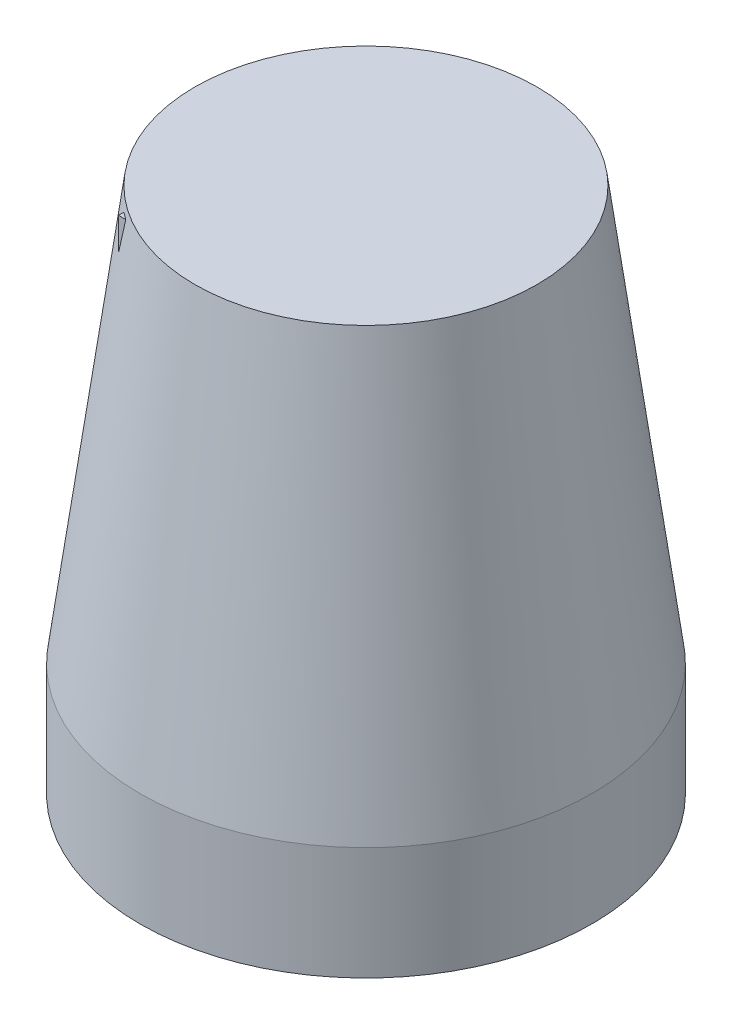
ISO-10303-21;
HEADER;
FILE_DESCRIPTION(('STEP AP214'),'2;1');
FILE_NAME('part.step','',(''),(''),'','','');
FILE_SCHEMA(('AUTOMOTIVE_DESIGN { 1 0 10303 214 1 1 1 1 }'));
ENDSEC;
DATA;
#1=APPLICATION_CONTEXT('core data for automotive mechanical design processes');
#2=APPLICATION_PROTOCOL_DEFINITION('international standard','automotive_design',2000,#1);
#3=PRODUCT_CONTEXT('',#1,'mechanical');
#4=PRODUCT('Part','Part','',(#3));
#5=PRODUCT_RELATED_PRODUCT_CATEGORY('part','',(#4));
#6=PRODUCT_DEFINITION_FORMATION('','',#4);
#7=PRODUCT_DEFINITION_CONTEXT('part definition',#1,'design');
#8=PRODUCT_DEFINITION('design','',#6,#7);
#9=PRODUCT_DEFINITION_SHAPE('','',#8);
#10=(LENGTH_UNIT() NAMED_UNIT(*) SI_UNIT(.MILLI.,.METRE.));
#11=(NAMED_UNIT(*) PLANE_ANGLE_UNIT() SI_UNIT($,.RADIAN.));
#12=(NAMED_UNIT(*) SI_UNIT($,.STERADIAN.) SOLID_ANGLE_UNIT());
#13=UNCERTAINTY_MEASURE_WITH_UNIT(LENGTH_MEASURE(1.E-05),#10,'distance_accuracy_value','');
#14=(GEOMETRIC_REPRESENTATION_CONTEXT(3) GLOBAL_UNCERTAINTY_ASSIGNED_CONTEXT((#13)) GLOBAL_UNIT_ASSIGNED_CONTEXT((#10,
#11,#12)) REPRESENTATION_CONTEXT('',''));
#15=CARTESIAN_POINT('',(0.,0.,0.));
#16=DIRECTION('',(0.,0.,1.));
#17=DIRECTION('',(1.,0.,0.));
#18=AXIS2_PLACEMENT_3D('',#15,#16,#17);
#19=CARTESIAN_POINT('',(0.,12.0904,0.));
#20=DIRECTION('',(0.,1.,0.));
#21=DIRECTION('',(0.,0.,1.));
#22=AXIS2_PLACEMENT_3D('',#19,#20,#21);
#23=PLANE('',#22);
#24=CARTESIAN_POINT('',(0.,12.0904,0.));
#25=DIRECTION('',(0.,1.,0.));
#26=DIRECTION('',(0.,0.,1.));
#27=AXIS2_PLACEMENT_3D('',#24,#25,#26);
#28=CIRCLE('',#27,5.0038);
#29=CARTESIAN_POINT('',(0.,12.0904,5.0038));
#30=VERTEX_POINT('',#29);
#31=EDGE_CURVE('E155',#30,#30,#28,.F.);
#32=ORIENTED_EDGE('',*,*,#31,.F.);
#33=EDGE_LOOP('',(#32));
#34=FACE_BOUND('',#33,.T.);
#35=ADVANCED_FACE('F35',(#34),#23,.T.);
#36=CARTESIAN_POINT('',(0.,12.0904,0.));
#37=DIRECTION('',(0.,-1.,0.));
#38=DIRECTION('',(0.,0.,-1.));
#39=AXIS2_PLACEMENT_3D('',#36,#37,#38);
#40=CONICAL_SURFACE('',#39,5.0038,0.131588141457921);
#41=CARTESIAN_POINT('',(-3.12198983804283,19.7399633322079,2.48678838927046));
#42=CARTESIAN_POINT('',(-3.12198983804283,19.4522116923415,2.54789214505273));
#43=CARTESIAN_POINT('',(-3.12198983804283,19.1641928931232,2.60772136295525));
#44=CARTESIAN_POINT('',(-3.12198983804283,18.5877184167729,2.72521345521346));
#45=CARTESIAN_POINT('',(-3.12198983804283,18.2992627472226,2.7828763667267));
#46=CARTESIAN_POINT('',(-3.12198983804283,17.7220173087251,2.89641765552094));
#47=CARTESIAN_POINT('',(-3.12198983804283,17.4332275581975,2.95229612674271));
#48=CARTESIAN_POINT('',(-3.12198983804283,16.8553580192587,3.06253836352553));
#49=CARTESIAN_POINT('',(-3.12198983804283,16.566278229414,3.11690212156202));
#50=CARTESIAN_POINT('',(-3.12198983804283,15.6987457444536,3.27804685380591));
#51=CARTESIAN_POINT('',(-3.12198983804283,15.1199338115593,3.38289417940131));
#52=CARTESIAN_POINT('',(-3.12198983804283,13.9616147091661,3.58869571843573));
#53=CARTESIAN_POINT('',(-3.12198983804283,13.3821075315747,3.68964988609621));
#54=CARTESIAN_POINT('',(-3.12198983804283,12.4557495363392,3.84851093069397));
#55=CARTESIAN_POINT('',(-3.12198983804283,12.1090668083862,3.90740082331989));
#56=CARTESIAN_POINT('',(-3.12198983804283,11.4155388168871,4.02422092619619));
#57=CARTESIAN_POINT('',(-3.12198983804283,11.0686935529122,4.08215113389978));
#58=CARTESIAN_POINT('',(-3.12198983804283,9.96812129473484,4.26459867647989));
#59=CARTESIAN_POINT('',(-3.12198983804283,9.21413500211513,4.38755259788751));
#60=CARTESIAN_POINT('',(-3.12198983804283,7.70566721631703,4.63038618733378));
#61=CARTESIAN_POINT('',(-3.12198983804283,6.95118572190914,4.75026584770975));
#62=CARTESIAN_POINT('',(-3.12198983804283,5.44182040013938,4.98757473021507));
#63=CARTESIAN_POINT('',(-3.12198983804283,4.6869365640709,5.10500389690844));
#64=CARTESIAN_POINT('',(-3.12198983804283,3.17686263186269,5.33786677211033));
#65=CARTESIAN_POINT('',(-3.12198983804283,2.4216725361259,5.45330048323556));
#66=CARTESIAN_POINT('',(-3.12198983804283,0.562927641732989,5.73534725665502));
#67=CARTESIAN_POINT('',(-3.12198983804283,-0.540768565807667,5.90102811104203));
#68=CARTESIAN_POINT('',(-3.12198983804283,-2.7485663473493,6.22966861212173));
#69=CARTESIAN_POINT('',(-3.12198983804283,-3.85266792176217,6.39262825604153));
#70=CARTESIAN_POINT('',(-3.12198983804283,-7.16545598671207,6.87829921326512));
#71=CARTESIAN_POINT('',(-3.12198983804283,-9.3746130552607,7.19780063025161));
#72=CARTESIAN_POINT('',(-3.12198983804283,-12.6887960937731,7.67277557638764));
#73=CARTESIAN_POINT('',(-3.12198983804283,-13.793518780198,7.83037650053189));
#74=CARTESIAN_POINT('',(-3.12198983804283,-16.0031356373172,8.14437445037939));
#75=CARTESIAN_POINT('',(-3.12198983804283,-17.1080298080447,8.30077147584949));
#76=CARTESIAN_POINT('',(-3.12198983804283,-19.317943190818,8.61255497226089));
#77=CARTESIAN_POINT('',(-3.12198983804283,-20.4229624006698,8.7679414587678));
#78=CARTESIAN_POINT('',(-3.12198983804283,-22.6331216796151,9.0778484453025));
#79=CARTESIAN_POINT('',(-3.12198983804283,-23.7382617486454,9.23236894578192));
#80=CARTESIAN_POINT('',(-3.12198983804283,-24.8434522045094,9.38652759915528));
#81=B_SPLINE_CURVE_WITH_KNOTS('',3,(#41,#42,#43,#44,#45,#46,#47,#48,#49,#50,#51,#52,#53,#54,#55,
#56,#57,#58,#59,#60,#61,#62,#63,#64,#65,#66,#67,#68,#69,#70,#71,#72,#73,#74,#75,#76,#77,#78,#79,
#80),.UNSPECIFIED.,.F.,.F.,(4,2,2,2,2,2,2,2,2,2,2,2,2,2,2,2,2,2,2,4),(0.,0.882495479478428,
1.76497581504104,2.64740961611204,3.52984780001966,5.29452207309541,7.0592170901516,
8.1141624141285,9.16911053723785,11.4609381898722,13.7527715543929,16.0446567095365,
18.3365388590316,21.6847214775792,25.0329075077008,31.7293182903437,35.077041586301,
38.4247655306242,41.772437786346,45.1201082959706),.UNSPECIFIED.);
#82=CARTESIAN_POINT('',(-3.12198983804283,11.8364,3.95332214751808));
#83=VERTEX_POINT('',#82);
#84=CARTESIAN_POINT('',(-3.12198983804283,10.8902391797452,4.11170049143638));
#85=VERTEX_POINT('',#84);
#86=EDGE_CURVE('E83',#83,#85,#81,.T.);
#87=ORIENTED_EDGE('',*,*,#86,.F.);
#88=CARTESIAN_POINT('',(0.,11.8364,0.));
#89=DIRECTION('',(0.,1.,0.));
#90=DIRECTION('',(0.,0.,1.));
#91=AXIS2_PLACEMENT_3D('',#88,#89,#90);
#92=CIRCLE('',#91,5.03741764705882);
#93=CARTESIAN_POINT('',(-2.91023978730645,11.8364,4.11170049143638));
#94=VERTEX_POINT('',#93);
#95=EDGE_CURVE('E12',#94,#83,#92,.F.);
#96=ORIENTED_EDGE('',*,*,#95,.F.);
#97=CARTESIAN_POINT('',(-6.33550725796729,-7.16868375464469,4.11170049143638));
#98=CARTESIAN_POINT('',(-6.24879506256221,-6.61913936845216,4.11170049143638));
#99=CARTESIAN_POINT('',(-6.16157532513931,-6.06967496075567,4.11170049143638));
#100=CARTESIAN_POINT('',(-5.98596638673181,-4.97093153466256,4.11170049143638));
#101=CARTESIAN_POINT('',(-5.8975771824707,-4.42165251678978,4.11170049143638));
#102=CARTESIAN_POINT('',(-5.63041200107386,-2.77405904186917,4.11170049143638));
#103=CARTESIAN_POINT('',(-5.44965061326439,-1.67606549786326,4.11170049143638));
#104=CARTESIAN_POINT('',(-5.08104541628945,0.519058486915517,4.11170049143638));
#105=CARTESIAN_POINT('',(-4.89319962007791,1.61618859608877,4.11170049143638));
#106=CARTESIAN_POINT('',(-4.60403039376013,3.26056748307197,4.11170049143638));
#107=CARTESIAN_POINT('',(-4.50640857955593,3.80846710842357,4.11170049143638));
#108=CARTESIAN_POINT('',(-4.30816336779334,4.90372230816399,4.11170049143638));
#109=CARTESIAN_POINT('',(-4.20753998336858,5.45107788492252,4.11170049143638));
#110=CARTESIAN_POINT('',(-4.03401022505142,6.37741479964129,4.11170049143638));
#111=CARTESIAN_POINT('',(-3.96206285592455,6.75657573696066,4.11170049143638));
#112=CARTESIAN_POINT('',(-3.81608224190747,7.51449902546523,4.11170049143638));
#113=CARTESIAN_POINT('',(-3.74204898422404,7.893261374191,4.11170049143638));
#114=CARTESIAN_POINT('',(-3.59150863806145,8.6502964758291,4.11170049143638));
#115=CARTESIAN_POINT('',(-3.51500154088188,9.02856922701468,4.11170049143638));
#116=CARTESIAN_POINT('',(-3.35900472562938,9.78449556989892,4.11170049143638));
#117=CARTESIAN_POINT('',(-3.27951504809976,10.1621491699412,4.11170049143638));
#118=CARTESIAN_POINT('',(-3.11683447983629,10.9168039503427,4.11170049143638));
#119=CARTESIAN_POINT('',(-3.03364225869499,11.2938048447865,4.11170049143638));
#120=CARTESIAN_POINT('',(-2.86261812777383,12.0467812283401,4.11170049143638));
#121=CARTESIAN_POINT('',(-2.77478595661451,12.4227566584258,4.11170049143638));
#122=CARTESIAN_POINT('',(-2.59304190833798,13.173349841718,4.11170049143638));
#123=CARTESIAN_POINT('',(-2.49912837428376,13.5479671952928,4.11170049143638));
#124=CARTESIAN_POINT('',(-2.30308617193259,14.2950249099567,4.11170049143638));
#125=CARTESIAN_POINT('',(-2.20095869390855,14.6674655781066,4.11170049143638));
#126=CARTESIAN_POINT('',(-2.03862812293197,15.2237289889329,4.11170049143638));
#127=CARTESIAN_POINT('',(-1.98295506464057,15.4088715438881,4.11170049143638));
#128=CARTESIAN_POINT('',(-1.86775901885054,15.777997683649,4.11170049143638));
#129=CARTESIAN_POINT('',(-1.80823540441363,15.9619810743438,4.11170049143638));
#130=CARTESIAN_POINT('',(-1.68425124415225,16.3281670100451,4.11170049143638));
#131=CARTESIAN_POINT('',(-1.61979355531736,16.5103705177614,4.11170049143638));
#132=CARTESIAN_POINT('',(-1.48419183933195,16.8722447503282,4.11170049143638));
#133=CARTESIAN_POINT('',(-1.4130504405798,17.0519164391265,4.11170049143638));
#134=CARTESIAN_POINT('',(-1.29891563656826,17.3185389792824,4.11170049143638));
#135=CARTESIAN_POINT('',(-1.25957532766933,17.4070500805944,4.11170049143638));
#136=CARTESIAN_POINT('',(-1.17780702718579,17.5826275125751,4.11170049143638));
#137=CARTESIAN_POINT('',(-1.13537962783556,17.6696941164443,4.11170049143638));
#138=CARTESIAN_POINT('',(-1.04643932683877,17.8420414610034,4.11170049143638));
#139=CARTESIAN_POINT('',(-0.999915238122806,17.9273164711859,4.11170049143638));
#140=CARTESIAN_POINT('',(-0.90156893730155,18.0947231220583,4.11170049143638));
#141=CARTESIAN_POINT('',(-0.849751888274437,18.1768577205951,4.11170049143638));
#142=CARTESIAN_POINT('',(-0.738095703882276,18.3369059950169,4.11170049143638));
#143=CARTESIAN_POINT('',(-0.678172214749743,18.414761201943,4.11170049143638));
#144=CARTESIAN_POINT('',(-0.547352178240651,18.5604745349227,4.11170049143638));
#145=CARTESIAN_POINT('',(-0.476552647437503,18.6284115885118,4.11170049143638));
#146=CARTESIAN_POINT('',(-0.368041847127581,18.7072823073283,4.11170049143638));
#147=CARTESIAN_POINT('',(-0.337124387581408,18.72739657188,4.11170049143638));
#148=CARTESIAN_POINT('',(-0.272833239398235,18.7633360514704,4.11170049143638));
#149=CARTESIAN_POINT('',(-0.239459648742237,18.7791614374852,4.11170049143638));
#150=CARTESIAN_POINT('',(-0.170032665588774,18.8052681404503,4.11170049143638));
#151=CARTESIAN_POINT('',(-0.133949617255644,18.8154731948548,4.11170049143638));
#152=CARTESIAN_POINT('',(-0.0604932388283377,18.8285752812534,4.11170049143638));
#153=CARTESIAN_POINT('',(-0.0231225617837874,18.8314865240422,4.11170049143638));
#154=CARTESIAN_POINT('',(0.0467992450453987,18.8296798162596,4.11170049143638));
#155=CARTESIAN_POINT('',(0.0793770910956985,18.8258573282741,4.11170049143638));
#156=CARTESIAN_POINT('',(0.143421748899138,18.8127576670881,4.11170049143638));
#157=CARTESIAN_POINT('',(0.174887164183315,18.8034738790878,4.11170049143638));
#158=CARTESIAN_POINT('',(0.247579790590536,18.7760643562285,4.11170049143638));
#159=CARTESIAN_POINT('',(0.288037335161957,18.7559276770649,4.11170049143638));
#160=CARTESIAN_POINT('',(0.365350849165239,18.7096731583888,4.11170049143638));
#161=CARTESIAN_POINT('',(0.402197332638204,18.6835401378635,4.11170049143638));
#162=CARTESIAN_POINT('',(0.504338441815512,18.6019510688254,4.11170049143638));
#163=CARTESIAN_POINT('',(0.565389431545562,18.5412726556251,4.11170049143638));
#164=CARTESIAN_POINT('',(0.679148833279831,18.412626898925,4.11170049143638));
#165=CARTESIAN_POINT('',(0.731827194552524,18.3446347062239,4.11170049143638));
#166=CARTESIAN_POINT('',(0.827244750687464,18.2099952218497,4.11170049143638));
#167=CARTESIAN_POINT('',(0.870440738040779,18.1436681583969,4.11170049143638));
#168=CARTESIAN_POINT('',(0.95298515955361,18.0086440489643,4.11170049143638));
#169=CARTESIAN_POINT('',(0.992331239057921,17.9399455869208,4.11170049143638));
#170=CARTESIAN_POINT('',(1.10607322671223,17.7311465342014,4.11170049143638));
#171=CARTESIAN_POINT('',(1.17599022628209,17.5886186471443,4.11170049143638));
#172=CARTESIAN_POINT('',(1.30836218332337,17.2993170647624,4.11170049143638));
#173=CARTESIAN_POINT('',(1.37077467006526,17.1525245531333,4.11170049143638));
#174=CARTESIAN_POINT('',(1.48986278727252,16.8568874312346,4.11170049143638));
#175=CARTESIAN_POINT('',(1.54654648384408,16.7080460512081,4.11170049143638));
#176=CARTESIAN_POINT('',(1.65495441084846,16.4108195289553,4.11170049143638));
#177=CARTESIAN_POINT('',(1.70673447330527,16.2624545438854,4.11170049143638));
#178=CARTESIAN_POINT('',(1.80704995079787,15.9646277245003,4.11170049143638));
#179=CARTESIAN_POINT('',(1.8555851762946,15.8151658266765,4.11170049143638));
#180=CARTESIAN_POINT('',(1.9973174938378,15.3654746511877,4.11170049143638));
#181=CARTESIAN_POINT('',(2.08661359433444,15.0640180108783,4.11170049143638));
#182=CARTESIAN_POINT('',(2.25811188537732,14.4586397870123,4.11170049143638));
#183=CARTESIAN_POINT('',(2.34030327735297,14.1547151934891,4.11170049143638));
#184=CARTESIAN_POINT('',(2.49927388347165,13.545508683329,4.11170049143638));
#185=CARTESIAN_POINT('',(2.57605391275173,13.2402269785164,4.11170049143638));
#186=CARTESIAN_POINT('',(2.72520831967036,12.6295902429157,4.11170049143638));
#187=CARTESIAN_POINT('',(2.79759552746366,12.32423832859,4.11170049143638));
#188=CARTESIAN_POINT('',(2.93904514426567,11.7127565578062,4.11170049143638));
#189=CARTESIAN_POINT('',(3.00810743259792,11.406626673536,4.11170049143638));
#190=CARTESIAN_POINT('',(3.21113777966526,10.4878221743261,4.11170049143638));
#191=CARTESIAN_POINT('',(3.34106380138475,9.87425475727396,4.11170049143638));
#192=CARTESIAN_POINT('',(3.57180861147958,8.75026662544904,4.11170049143638));
#193=CARTESIAN_POINT('',(3.67381452352091,8.24008672408638,4.11170049143638));
#194=CARTESIAN_POINT('',(3.87369732525523,7.21891337699643,4.11170049143638));
#195=CARTESIAN_POINT('',(3.97157416967939,6.70791992241349,4.11170049143638));
#196=CARTESIAN_POINT('',(4.16404737141863,5.68513836267574,4.11170049143638));
#197=CARTESIAN_POINT('',(4.25864260558916,5.17335004688354,4.11170049143638));
#198=CARTESIAN_POINT('',(4.4451091586686,4.14927716027304,4.11170049143638));
#199=CARTESIAN_POINT('',(4.53698047217373,3.63699258847234,4.11170049143638));
#200=CARTESIAN_POINT('',(4.71830058500275,2.61285845437415,4.11170049143638));
#201=CARTESIAN_POINT('',(4.80775309585075,2.10100954813103,4.11170049143638));
#202=CARTESIAN_POINT('',(4.9847370188131,1.07697895107307,4.11170049143638));
#203=CARTESIAN_POINT('',(5.07226842683253,0.564797259551261,4.11170049143638));
#204=CARTESIAN_POINT('',(5.24564745966625,-0.459613882877792,4.11170049143638));
#205=CARTESIAN_POINT('',(5.33149582361217,-0.971843208844427,4.11170049143638));
#206=CARTESIAN_POINT('',(5.50176062547431,-1.99653685929707,4.11170049143638));
#207=CARTESIAN_POINT('',(5.58617707164057,-2.50900118241165,4.11170049143638));
#208=CARTESIAN_POINT('',(5.66998375464469,-3.0215645639894,4.11170049143638));
#209=B_SPLINE_CURVE_WITH_KNOTS('',3,(#97,#98,#99,#100,#101,#102,#103,#104,#105,#106,#107,#108,
#109,#110,#111,#112,#113,#114,#115,#116,#117,#118,#119,#120,#121,#122,#123,#124,#125,#126,#127,
#128,#129,#130,#131,#132,#133,#134,#135,#136,#137,#138,#139,#140,#141,#142,#143,#144,#145,#146,
#147,#148,#149,#150,#151,#152,#153,#154,#155,#156,#157,#158,#159,#160,#161,#162,#163,#164,#165,
#166,#167,#168,#169,#170,#171,#172,#173,#174,#175,#176,#177,#178,#179,#180,#181,#182,#183,#184,
#185,#186,#187,#188,#189,#190,#191,#192,#193,#194,#195,#196,#197,#198,#199,#200,#201,#202,#203,
#204,#205,#206,#207,#208),.UNSPECIFIED.,.F.,.F.,(4,2,2,2,2,2,2,2,2,2,2,2,2,2,2,2,2,2,2,2,2,2,2,
2,2,2,2,2,2,2,2,2,2,2,2,2,2,2,2,2,2,2,2,2,2,2,2,2,2,2,2,2,2,2,2,4),(0.,1.66903014882891,
3.33806497479487,6.67636947705516,10.0156173793376,11.685196843775,13.3547690038969,
14.5125444894651,15.6703270774769,16.8281137378203,17.985884665645,19.1440750195058,
20.3023306867118,21.460903272699,22.6193082727452,23.1992744089492,23.7793352126734,
24.3590626466856,24.9385630470726,25.2291002458172,25.5195818534649,25.8108828724488,
26.1019024039955,26.3962240843184,26.6880583647398,26.7984593136761,26.9088558608367,
27.0207156303514,27.1323572893871,27.2302490004233,27.3282595240492,27.4630630287432,
27.5982116581566,27.8549987367215,28.1126876101358,28.3499605860909,28.5873777859831,
29.063202134601,29.5416038622499,30.0193223336033,30.4907012727737,30.9621077223562,
31.9051690509156,32.8496394357134,33.7939672454129,34.7353891393471,35.6768451760425,
37.5582830630324,39.1190996131469,40.6799332707549,42.2412959629765,43.8026617524617,
45.3614774265079,46.9202964229271,48.4784147721402,50.0365241411626),.UNSPECIFIED.);
#210=EDGE_CURVE('E49',#85,#94,#209,.T.);
#211=ORIENTED_EDGE('',*,*,#210,.F.);
#212=EDGE_LOOP('',(#87,#96,#211));
#213=FACE_BOUND('',#212,.T.);
#214=CARTESIAN_POINT('',(0.,0.,0.));
#215=DIRECTION('',(0.,1.,0.));
#216=DIRECTION('',(0.,0.,1.));
#217=AXIS2_PLACEMENT_3D('',#214,#215,#216);
#218=CIRCLE('',#217,6.604);
#219=CARTESIAN_POINT('',(0.,0.,6.604));
#220=VERTEX_POINT('',#219);
#221=EDGE_CURVE('E162',#220,#220,#218,.T.);
#222=ORIENTED_EDGE('',*,*,#221,.T.);
#223=EDGE_LOOP('',(#222));
#224=FACE_BOUND('',#223,.T.);
#225=ORIENTED_EDGE('',*,*,#31,.T.);
#226=EDGE_LOOP('',(#225));
#227=FACE_BOUND('',#226,.T.);
#228=ADVANCED_FACE('F101',(#213,#224,#227),#40,.T.);
#229=CARTESIAN_POINT('',(0.,-3.302,0.));
#230=DIRECTION('',(0.,1.,0.));
#231=DIRECTION('',(0.,0.,1.));
#232=AXIS2_PLACEMENT_3D('',#229,#230,#231);
#233=CYLINDRICAL_SURFACE('',#232,6.604);
#234=CARTESIAN_POINT('',(0.,-3.302,0.));
#235=DIRECTION('',(0.,1.,0.));
#236=DIRECTION('',(0.,0.,1.));
#237=AXIS2_PLACEMENT_3D('',#234,#235,#236);
#238=CIRCLE('',#237,6.604);
#239=CARTESIAN_POINT('',(0.,-3.302,6.604));
#240=VERTEX_POINT('',#239);
#241=EDGE_CURVE('E165',#240,#240,#238,.T.);
#242=ORIENTED_EDGE('',*,*,#241,.T.);
#243=EDGE_LOOP('',(#242));
#244=FACE_BOUND('',#243,.T.);
#245=ORIENTED_EDGE('',*,*,#221,.F.);
#246=EDGE_LOOP('',(#245));
#247=FACE_BOUND('',#246,.T.);
#248=ADVANCED_FACE('F131',(#244,#247),#233,.T.);
#249=CARTESIAN_POINT('',(0.,-3.302,0.));
#250=DIRECTION('',(0.,1.,0.));
#251=DIRECTION('',(0.,0.,1.));
#252=AXIS2_PLACEMENT_3D('',#249,#250,#251);
#253=PLANE('',#252);
#254=CARTESIAN_POINT('',(0.,-3.302,0.));
#255=DIRECTION('',(0.,-1.,0.));
#256=DIRECTION('',(0.,0.,-1.));
#257=AXIS2_PLACEMENT_3D('',#254,#255,#256);
#258=CIRCLE('',#257,5.2705);
#259=CARTESIAN_POINT('',(0.,-3.302,-5.2705));
#260=VERTEX_POINT('',#259);
#261=EDGE_CURVE('E168',#260,#260,#258,.T.);
#262=ORIENTED_EDGE('',*,*,#261,.F.);
#263=EDGE_LOOP('',(#262));
#264=FACE_BOUND('',#263,.T.);
#265=ORIENTED_EDGE('',*,*,#241,.F.);
#266=EDGE_LOOP('',(#265));
#267=FACE_BOUND('',#266,.T.);
#268=ADVANCED_FACE('F118',(#264,#267),#253,.F.);
#269=CARTESIAN_POINT('',(0.,-0.3556,0.));
#270=DIRECTION('',(0.,-1.,0.));
#271=DIRECTION('',(0.,0.,-1.));
#272=AXIS2_PLACEMENT_3D('',#269,#270,#271);
#273=PLANE('',#272);
#274=CARTESIAN_POINT('',(0.,-0.355599999999999,0.));
#275=DIRECTION('',(0.,-1.,0.));
#276=DIRECTION('',(0.,0.,-1.));
#277=AXIS2_PLACEMENT_3D('',#274,#275,#276);
#278=CIRCLE('',#277,2.9972);
#279=CARTESIAN_POINT('',(-1.4986,-0.355599999999999,2.59565134022272));
#280=VERTEX_POINT('',#279);
#281=CARTESIAN_POINT('',(-1.4986,-0.355599999999999,-2.59565134022272));
#282=VERTEX_POINT('',#281);
#283=EDGE_CURVE('E143',#280,#282,#278,.F.);
#284=ORIENTED_EDGE('',*,*,#283,.T.);
#285=DIRECTION('',(0.,0.,1.));
#286=VECTOR('',#285,1.);
#287=CARTESIAN_POINT('',(-1.4986,-0.3556,4.11170049143638));
#288=LINE('',#287,#286);
#289=EDGE_CURVE('E78',#282,#280,#288,.T.);
#290=ORIENTED_EDGE('',*,*,#289,.T.);
#291=EDGE_LOOP('',(#284,#290));
#292=FACE_BOUND('',#291,.T.);
#293=CARTESIAN_POINT('',(0.,-0.3556,0.));
#294=DIRECTION('',(0.,-1.,0.));
#295=DIRECTION('',(0.,0.,-1.));
#296=AXIS2_PLACEMENT_3D('',#293,#294,#295);
#297=CIRCLE('',#296,5.2705);
#298=CARTESIAN_POINT('',(0.,-0.3556,-5.2705));
#299=VERTEX_POINT('',#298);
#300=EDGE_CURVE('E152',#299,#299,#297,.T.);
#301=ORIENTED_EDGE('',*,*,#300,.T.);
#302=EDGE_LOOP('',(#301));
#303=FACE_BOUND('',#302,.T.);
#304=ADVANCED_FACE('F114',(#292,#303),#273,.T.);
#305=CARTESIAN_POINT('',(0.,-0.3556,0.));
#306=DIRECTION('',(0.,-1.,0.));
#307=DIRECTION('',(0.,0.,-1.));
#308=AXIS2_PLACEMENT_3D('',#305,#306,#307);
#309=CYLINDRICAL_SURFACE('',#308,5.2705);
#310=ORIENTED_EDGE('',*,*,#300,.F.);
#311=EDGE_LOOP('',(#310));
#312=FACE_BOUND('',#311,.T.);
#313=ORIENTED_EDGE('',*,*,#261,.T.);
#314=EDGE_LOOP('',(#313));
#315=FACE_BOUND('',#314,.T.);
#316=ADVANCED_FACE('F117',(#312,#315),#309,.F.);
#317=CARTESIAN_POINT('',(0.,8.128,0.));
#318=DIRECTION('',(0.,-1.,0.));
#319=DIRECTION('',(0.,0.,-1.));
#320=AXIS2_PLACEMENT_3D('',#317,#318,#319);
#321=PLANE('',#320);
#322=DIRECTION('',(0.,0.,1.));
#323=VECTOR('',#322,1.);
#324=CARTESIAN_POINT('',(-1.4986,8.128,0.));
#325=LINE('',#324,#323);
#326=CARTESIAN_POINT('',(-1.4986,8.128,-2.59565134022272));
#327=VERTEX_POINT('',#326);
#328=CARTESIAN_POINT('',(-1.4986,8.128,2.59565134022272));
#329=VERTEX_POINT('',#328);
#330=EDGE_CURVE('E84',#327,#329,#325,.T.);
#331=ORIENTED_EDGE('',*,*,#330,.F.);
#332=CARTESIAN_POINT('',(0.,8.128,0.));
#333=DIRECTION('',(0.,-1.,0.));
#334=DIRECTION('',(0.,0.,-1.));
#335=AXIS2_PLACEMENT_3D('',#332,#333,#334);
#336=CIRCLE('',#335,2.9972);
#337=EDGE_CURVE('E151',#327,#329,#336,.T.);
#338=ORIENTED_EDGE('',*,*,#337,.T.);
#339=EDGE_LOOP('',(#331,#338));
#340=FACE_BOUND('',#339,.T.);
#341=ADVANCED_FACE('F122',(#340),#321,.T.);
#342=CARTESIAN_POINT('',(0.,8.128,0.));
#343=DIRECTION('',(0.,-1.,0.));
#344=DIRECTION('',(0.,0.,-1.));
#345=AXIS2_PLACEMENT_3D('',#342,#343,#344);
#346=CYLINDRICAL_SURFACE('',#345,2.9972);
#347=ORIENTED_EDGE('',*,*,#283,.F.);
#348=DIRECTION('',(0.,-1.,0.));
#349=VECTOR('',#348,1.);
#350=CARTESIAN_POINT('',(-1.4986,8.128,2.59565134022272));
#351=LINE('',#350,#349);
#352=EDGE_CURVE('E42',#280,#329,#351,.F.);
#353=ORIENTED_EDGE('',*,*,#352,.T.);
#354=ORIENTED_EDGE('',*,*,#337,.F.);
#355=DIRECTION('',(0.,-1.,0.));
#356=VECTOR('',#355,1.);
#357=CARTESIAN_POINT('',(-1.4986,8.128,-2.59565134022272));
#358=LINE('',#357,#356);
#359=EDGE_CURVE('E153',#327,#282,#358,.T.);
#360=ORIENTED_EDGE('',*,*,#359,.T.);
#361=EDGE_LOOP('',(#347,#353,#354,#360));
#362=FACE_BOUND('',#361,.T.);
#363=ADVANCED_FACE('F112',(#362),#346,.F.);
#364=CARTESIAN_POINT('',(-1.4986,11.8364,4.11170049143638));
#365=DIRECTION('',(1.,0.,0.));
#366=DIRECTION('',(0.,0.,-1.));
#367=AXIS2_PLACEMENT_3D('',#364,#365,#366);
#368=PLANE('',#367);
#369=ORIENTED_EDGE('',*,*,#352,.F.);
#370=ORIENTED_EDGE('',*,*,#289,.F.);
#371=ORIENTED_EDGE('',*,*,#359,.F.);
#372=ORIENTED_EDGE('',*,*,#330,.T.);
#373=EDGE_LOOP('',(#369,#370,#371,#372));
#374=FACE_BOUND('',#373,.T.);
#375=ADVANCED_FACE('F109',(#374),#368,.T.);
#376=CARTESIAN_POINT('',(-3.12198983804283,11.8364,4.11170049143638));
#377=DIRECTION('',(-1.,0.,0.));
#378=DIRECTION('',(0.,0.,1.));
#379=AXIS2_PLACEMENT_3D('',#376,#377,#378);
#380=PLANE('',#379);
#381=DIRECTION('',(0.,0.,-1.));
#382=VECTOR('',#381,1.);
#383=CARTESIAN_POINT('',(-3.12198983804283,11.8364,4.11170049143638));
#384=LINE('',#383,#382);
#385=CARTESIAN_POINT('',(-3.12198983804283,11.8364,4.11170049143638));
#386=VERTEX_POINT('',#385);
#387=EDGE_CURVE('E77',#386,#83,#384,.T.);
#388=ORIENTED_EDGE('',*,*,#387,.T.);
#389=ORIENTED_EDGE('',*,*,#86,.T.);
#390=DIRECTION('',(0.,-1.,0.));
#391=VECTOR('',#390,1.);
#392=CARTESIAN_POINT('',(-3.12198983804283,11.8364,4.11170049143638));
#393=LINE('',#392,#391);
#394=EDGE_CURVE('E74',#386,#85,#393,.T.);
#395=ORIENTED_EDGE('',*,*,#394,.F.);
#396=EDGE_LOOP('',(#388,#389,#395));
#397=FACE_BOUND('',#396,.T.);
#398=ADVANCED_FACE('F82',(#397),#380,.T.);
#399=CARTESIAN_POINT('',(-1.4986,11.8364,4.11170049143638));
#400=DIRECTION('',(0.,0.,1.));
#401=DIRECTION('',(1.,0.,0.));
#402=AXIS2_PLACEMENT_3D('',#399,#400,#401);
#403=PLANE('',#402);
#404=ORIENTED_EDGE('',*,*,#394,.T.);
#405=ORIENTED_EDGE('',*,*,#210,.T.);
#406=DIRECTION('',(-1.,0.,0.));
#407=VECTOR('',#406,1.);
#408=CARTESIAN_POINT('',(-1.4986,11.8364,4.11170049143638));
#409=LINE('',#408,#407);
#410=EDGE_CURVE('E71',#94,#386,#409,.T.);
#411=ORIENTED_EDGE('',*,*,#410,.T.);
#412=EDGE_LOOP('',(#404,#405,#411));
#413=FACE_BOUND('',#412,.T.);
#414=ADVANCED_FACE('F73',(#413),#403,.T.);
#415=CARTESIAN_POINT('',(-1.4986,11.8364,-2.6479883423813));
#416=DIRECTION('',(0.,1.,0.));
#417=DIRECTION('',(0.,0.,1.));
#418=AXIS2_PLACEMENT_3D('',#415,#416,#417);
#419=PLANE('',#418);
#420=ORIENTED_EDGE('',*,*,#410,.F.);
#421=ORIENTED_EDGE('',*,*,#95,.T.);
#422=ORIENTED_EDGE('',*,*,#387,.F.);
#423=EDGE_LOOP('',(#420,#421,#422));
#424=FACE_BOUND('',#423,.T.);
#425=ADVANCED_FACE('F86',(#424),#419,.T.);
#426=CLOSED_SHELL('',(#35,#228,#248,#268,#304,#316,#341,#363,#375,#398,#414,#425));
#427=MANIFOLD_SOLID_BREP('B2',#426);
#428=ADVANCED_BREP_SHAPE_REPRESENTATION('',(#18,#427),#14);
#429=SHAPE_DEFINITION_REPRESENTATION(#9,#428);
ENDSEC;
END-ISO-10303-21;
